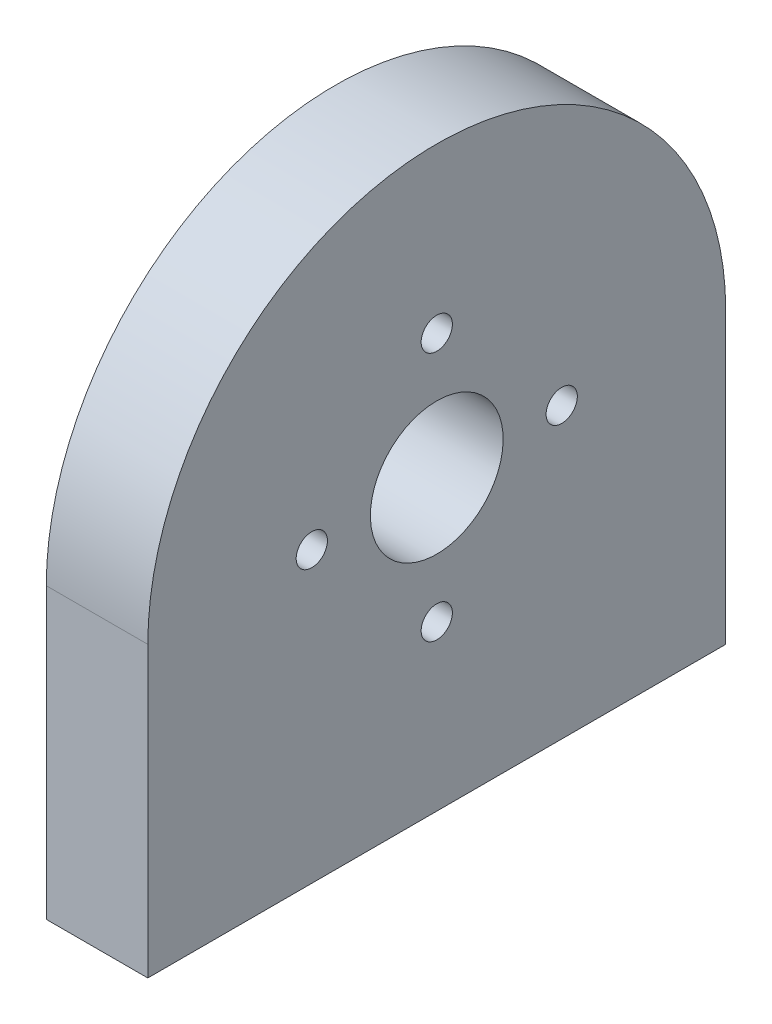
ISO-10303-21;
HEADER;
FILE_DESCRIPTION(('STEP AP214'),'2;1');
FILE_NAME('part.step','',(''),(''),'','','');
FILE_SCHEMA(('AUTOMOTIVE_DESIGN { 1 0 10303 214 1 1 1 1 }'));
ENDSEC;
DATA;
#1=APPLICATION_CONTEXT('core data for automotive mechanical design processes');
#2=APPLICATION_PROTOCOL_DEFINITION('international standard','automotive_design',2000,#1);
#3=PRODUCT_CONTEXT('',#1,'mechanical');
#4=PRODUCT('Part','Part','',(#3));
#5=PRODUCT_RELATED_PRODUCT_CATEGORY('part','',(#4));
#6=PRODUCT_DEFINITION_FORMATION('','',#4);
#7=PRODUCT_DEFINITION_CONTEXT('part definition',#1,'design');
#8=PRODUCT_DEFINITION('design','',#6,#7);
#9=PRODUCT_DEFINITION_SHAPE('','',#8);
#10=(LENGTH_UNIT() NAMED_UNIT(*) SI_UNIT(.MILLI.,.METRE.));
#11=(NAMED_UNIT(*) PLANE_ANGLE_UNIT() SI_UNIT($,.RADIAN.));
#12=(NAMED_UNIT(*) SI_UNIT($,.STERADIAN.) SOLID_ANGLE_UNIT());
#13=UNCERTAINTY_MEASURE_WITH_UNIT(LENGTH_MEASURE(1.E-05),#10,'distance_accuracy_value','');
#14=(GEOMETRIC_REPRESENTATION_CONTEXT(3) GLOBAL_UNCERTAINTY_ASSIGNED_CONTEXT((#13)) GLOBAL_UNIT_ASSIGNED_CONTEXT((#10,
#11,#12)) REPRESENTATION_CONTEXT('',''));
#15=CARTESIAN_POINT('',(0.,0.,0.));
#16=DIRECTION('',(0.,0.,1.));
#17=DIRECTION('',(1.,0.,0.));
#18=AXIS2_PLACEMENT_3D('',#15,#16,#17);
#19=CARTESIAN_POINT('',(-30.,-17.,-27.5));
#20=DIRECTION('',(1.,0.,0.));
#21=DIRECTION('',(0.,1.,0.));
#22=AXIS2_PLACEMENT_3D('',#19,#20,#21);
#23=CYLINDRICAL_SURFACE('',#22,1.);
#24=CARTESIAN_POINT('',(-21.,-17.,-27.5));
#25=DIRECTION('',(1.,0.,0.));
#26=DIRECTION('',(0.,0.,-1.));
#27=AXIS2_PLACEMENT_3D('',#24,#25,#26);
#28=CIRCLE('',#27,1.);
#29=CARTESIAN_POINT('',(-21.,-17.,-28.5));
#30=VERTEX_POINT('',#29);
#31=EDGE_CURVE('E115',#30,#30,#28,.F.);
#32=ORIENTED_EDGE('',*,*,#31,.T.);
#33=EDGE_LOOP('',(#32));
#34=FACE_BOUND('',#33,.T.);
#35=CARTESIAN_POINT('',(-14.5,-17.,-27.5));
#36=DIRECTION('',(1.,0.,0.));
#37=DIRECTION('',(0.,1.,0.));
#38=AXIS2_PLACEMENT_3D('',#35,#36,#37);
#39=CIRCLE('',#38,1.);
#40=CARTESIAN_POINT('',(-14.5,-16.,-27.5));
#41=VERTEX_POINT('',#40);
#42=EDGE_CURVE('E163',#41,#41,#39,.F.);
#43=ORIENTED_EDGE('',*,*,#42,.F.);
#44=EDGE_LOOP('',(#43));
#45=FACE_BOUND('',#44,.T.);
#46=ADVANCED_FACE('F47',(#34,#45),#23,.F.);
#47=CARTESIAN_POINT('',(-30.,-33.,-27.5000000000002));
#48=DIRECTION('',(1.,0.,0.));
#49=DIRECTION('',(0.,1.,0.));
#50=AXIS2_PLACEMENT_3D('',#47,#48,#49);
#51=CYLINDRICAL_SURFACE('',#50,1.);
#52=CARTESIAN_POINT('',(-21.,-33.,-27.5000000000002));
#53=DIRECTION('',(1.,0.,0.));
#54=DIRECTION('',(0.,0.,-1.));
#55=AXIS2_PLACEMENT_3D('',#52,#53,#54);
#56=CIRCLE('',#55,1.);
#57=CARTESIAN_POINT('',(-21.,-33.,-28.5000000000002));
#58=VERTEX_POINT('',#57);
#59=EDGE_CURVE('E127',#58,#58,#56,.F.);
#60=ORIENTED_EDGE('',*,*,#59,.T.);
#61=EDGE_LOOP('',(#60));
#62=FACE_BOUND('',#61,.T.);
#63=CARTESIAN_POINT('',(-14.5,-33.,-27.5000000000002));
#64=DIRECTION('',(1.,0.,0.));
#65=DIRECTION('',(0.,1.,0.));
#66=AXIS2_PLACEMENT_3D('',#63,#64,#65);
#67=CIRCLE('',#66,1.);
#68=CARTESIAN_POINT('',(-14.5,-32.,-27.5000000000002));
#69=VERTEX_POINT('',#68);
#70=EDGE_CURVE('E159',#69,#69,#67,.F.);
#71=ORIENTED_EDGE('',*,*,#70,.F.);
#72=EDGE_LOOP('',(#71));
#73=FACE_BOUND('',#72,.T.);
#74=ADVANCED_FACE('F49',(#62,#73),#51,.F.);
#75=CARTESIAN_POINT('',(-30.,-25.,-19.5000000000001));
#76=DIRECTION('',(1.,0.,0.));
#77=DIRECTION('',(0.,1.,0.));
#78=AXIS2_PLACEMENT_3D('',#75,#76,#77);
#79=CYLINDRICAL_SURFACE('',#78,1.);
#80=CARTESIAN_POINT('',(-21.,-25.,-19.5000000000001));
#81=DIRECTION('',(1.,0.,0.));
#82=DIRECTION('',(0.,0.,-1.));
#83=AXIS2_PLACEMENT_3D('',#80,#81,#82);
#84=CIRCLE('',#83,1.);
#85=CARTESIAN_POINT('',(-21.,-25.,-20.5000000000001));
#86=VERTEX_POINT('',#85);
#87=EDGE_CURVE('E131',#86,#86,#84,.F.);
#88=ORIENTED_EDGE('',*,*,#87,.T.);
#89=EDGE_LOOP('',(#88));
#90=FACE_BOUND('',#89,.T.);
#91=CARTESIAN_POINT('',(-14.5,-25.,-19.5000000000001));
#92=DIRECTION('',(1.,0.,0.));
#93=DIRECTION('',(0.,1.,0.));
#94=AXIS2_PLACEMENT_3D('',#91,#92,#93);
#95=CIRCLE('',#94,1.);
#96=CARTESIAN_POINT('',(-14.5,-24.,-19.5000000000001));
#97=VERTEX_POINT('',#96);
#98=EDGE_CURVE('E155',#97,#97,#95,.F.);
#99=ORIENTED_EDGE('',*,*,#98,.F.);
#100=EDGE_LOOP('',(#99));
#101=FACE_BOUND('',#100,.T.);
#102=ADVANCED_FACE('F179',(#90,#101),#79,.F.);
#103=CARTESIAN_POINT('',(-30.,-25.,-27.5));
#104=DIRECTION('',(1.,0.,0.));
#105=DIRECTION('',(0.,1.,0.));
#106=AXIS2_PLACEMENT_3D('',#103,#104,#105);
#107=CYLINDRICAL_SURFACE('',#106,4.25);
#108=CARTESIAN_POINT('',(-21.,-25.,-27.5));
#109=DIRECTION('',(1.,0.,0.));
#110=DIRECTION('',(0.,0.,-1.));
#111=AXIS2_PLACEMENT_3D('',#108,#109,#110);
#112=CIRCLE('',#111,4.25);
#113=CARTESIAN_POINT('',(-21.,-25.,-31.75));
#114=VERTEX_POINT('',#113);
#115=EDGE_CURVE('E109',#114,#114,#112,.F.);
#116=ORIENTED_EDGE('',*,*,#115,.T.);
#117=EDGE_LOOP('',(#116));
#118=FACE_BOUND('',#117,.T.);
#119=CARTESIAN_POINT('',(-14.5,-25.,-27.5));
#120=DIRECTION('',(1.,0.,0.));
#121=DIRECTION('',(0.,1.,0.));
#122=AXIS2_PLACEMENT_3D('',#119,#120,#121);
#123=CIRCLE('',#122,4.25);
#124=CARTESIAN_POINT('',(-14.5,-20.75,-27.5));
#125=VERTEX_POINT('',#124);
#126=EDGE_CURVE('E151',#125,#125,#123,.F.);
#127=ORIENTED_EDGE('',*,*,#126,.F.);
#128=EDGE_LOOP('',(#127));
#129=FACE_BOUND('',#128,.T.);
#130=ADVANCED_FACE('F187',(#118,#129),#107,.F.);
#131=CARTESIAN_POINT('',(-30.,-24.9999999999999,-35.5000000000001));
#132=DIRECTION('',(1.,0.,0.));
#133=DIRECTION('',(0.,1.,0.));
#134=AXIS2_PLACEMENT_3D('',#131,#132,#133);
#135=CYLINDRICAL_SURFACE('',#134,1.);
#136=CARTESIAN_POINT('',(-21.,-24.9999999999999,-35.5000000000001));
#137=DIRECTION('',(1.,0.,0.));
#138=DIRECTION('',(0.,0.,-1.));
#139=AXIS2_PLACEMENT_3D('',#136,#137,#138);
#140=CIRCLE('',#139,1.);
#141=CARTESIAN_POINT('',(-21.,-24.9999999999999,-36.5000000000001));
#142=VERTEX_POINT('',#141);
#143=EDGE_CURVE('E123',#142,#142,#140,.F.);
#144=ORIENTED_EDGE('',*,*,#143,.T.);
#145=EDGE_LOOP('',(#144));
#146=FACE_BOUND('',#145,.T.);
#147=CARTESIAN_POINT('',(-14.5,-24.9999999999999,-35.5000000000001));
#148=DIRECTION('',(1.,0.,0.));
#149=DIRECTION('',(0.,1.,0.));
#150=AXIS2_PLACEMENT_3D('',#147,#148,#149);
#151=CIRCLE('',#150,1.);
#152=CARTESIAN_POINT('',(-14.5,-23.9999999999999,-35.5000000000001));
#153=VERTEX_POINT('',#152);
#154=EDGE_CURVE('E147',#153,#153,#151,.F.);
#155=ORIENTED_EDGE('',*,*,#154,.F.);
#156=EDGE_LOOP('',(#155));
#157=FACE_BOUND('',#156,.T.);
#158=ADVANCED_FACE('F185',(#146,#157),#135,.F.);
#159=CARTESIAN_POINT('',(-25.,-25.,-27.5));
#160=DIRECTION('',(1.,0.,0.));
#161=DIRECTION('',(0.,1.,0.));
#162=AXIS2_PLACEMENT_3D('',#159,#160,#161);
#163=CYLINDRICAL_SURFACE('',#162,18.5);
#164=DIRECTION('',(1.,0.,0.));
#165=VECTOR('',#164,1.);
#166=CARTESIAN_POINT('',(-25.,-25.,-46.));
#167=LINE('',#166,#165);
#168=CARTESIAN_POINT('',(-21.,-25.,-46.));
#169=VERTEX_POINT('',#168);
#170=CARTESIAN_POINT('',(-14.5,-25.,-46.));
#171=VERTEX_POINT('',#170);
#172=EDGE_CURVE('E51',#169,#171,#167,.T.);
#173=ORIENTED_EDGE('',*,*,#172,.F.);
#174=CARTESIAN_POINT('',(-21.,-25.,-27.5));
#175=DIRECTION('',(1.,0.,0.));
#176=DIRECTION('',(0.,0.,-1.));
#177=AXIS2_PLACEMENT_3D('',#174,#175,#176);
#178=CIRCLE('',#177,18.5);
#179=CARTESIAN_POINT('',(-21.,-25.,-9.00000000000001));
#180=VERTEX_POINT('',#179);
#181=EDGE_CURVE('E110',#180,#169,#178,.F.);
#182=ORIENTED_EDGE('',*,*,#181,.F.);
#183=DIRECTION('',(1.,0.,0.));
#184=VECTOR('',#183,1.);
#185=CARTESIAN_POINT('',(-25.,-25.,-9.00000000000001));
#186=LINE('',#185,#184);
#187=CARTESIAN_POINT('',(-14.5,-25.,-9.00000000000001));
#188=VERTEX_POINT('',#187);
#189=EDGE_CURVE('E11',#180,#188,#186,.T.);
#190=ORIENTED_EDGE('',*,*,#189,.T.);
#191=CARTESIAN_POINT('',(-14.5,-25.,-27.5));
#192=DIRECTION('',(1.,0.,0.));
#193=DIRECTION('',(0.,1.,0.));
#194=AXIS2_PLACEMENT_3D('',#191,#192,#193);
#195=CIRCLE('',#194,18.5);
#196=EDGE_CURVE('E135',#171,#188,#195,.T.);
#197=ORIENTED_EDGE('',*,*,#196,.F.);
#198=EDGE_LOOP('',(#173,#182,#190,#197));
#199=FACE_BOUND('',#198,.T.);
#200=ADVANCED_FACE('F183',(#199),#163,.T.);
#201=CARTESIAN_POINT('',(-21.,-159.75,-55.));
#202=DIRECTION('',(1.,0.,0.));
#203=DIRECTION('',(0.,0.,-1.));
#204=AXIS2_PLACEMENT_3D('',#201,#202,#203);
#205=PLANE('',#204);
#206=ORIENTED_EDGE('',*,*,#87,.F.);
#207=EDGE_LOOP('',(#206));
#208=FACE_BOUND('',#207,.T.);
#209=ORIENTED_EDGE('',*,*,#143,.F.);
#210=EDGE_LOOP('',(#209));
#211=FACE_BOUND('',#210,.T.);
#212=ORIENTED_EDGE('',*,*,#115,.F.);
#213=EDGE_LOOP('',(#212));
#214=FACE_BOUND('',#213,.T.);
#215=ORIENTED_EDGE('',*,*,#31,.F.);
#216=EDGE_LOOP('',(#215));
#217=FACE_BOUND('',#216,.T.);
#218=ORIENTED_EDGE('',*,*,#59,.F.);
#219=EDGE_LOOP('',(#218));
#220=FACE_BOUND('',#219,.T.);
#221=DIRECTION('',(0.,1.,0.));
#222=VECTOR('',#221,1.);
#223=CARTESIAN_POINT('',(-21.,0.,-46.));
#224=LINE('',#223,#222);
#225=CARTESIAN_POINT('',(-21.,-43.5,-46.));
#226=VERTEX_POINT('',#225);
#227=EDGE_CURVE('E103',#226,#169,#224,.T.);
#228=ORIENTED_EDGE('',*,*,#227,.F.);
#229=DIRECTION('',(0.,0.,-1.));
#230=VECTOR('',#229,1.);
#231=CARTESIAN_POINT('',(-21.,-43.5,-46.));
#232=LINE('',#231,#230);
#233=CARTESIAN_POINT('',(-21.,-43.5,-9.00000000000001));
#234=VERTEX_POINT('',#233);
#235=EDGE_CURVE('E89',#234,#226,#232,.T.);
#236=ORIENTED_EDGE('',*,*,#235,.F.);
#237=DIRECTION('',(0.,1.,0.));
#238=VECTOR('',#237,1.);
#239=CARTESIAN_POINT('',(-21.,0.,-9.00000000000001));
#240=LINE('',#239,#238);
#241=EDGE_CURVE('E101',#234,#180,#240,.T.);
#242=ORIENTED_EDGE('',*,*,#241,.T.);
#243=ORIENTED_EDGE('',*,*,#181,.T.);
#244=EDGE_LOOP('',(#228,#236,#242,#243));
#245=FACE_BOUND('',#244,.T.);
#246=ADVANCED_FACE('F99',(#208,#211,#214,#217,#220,#245),#205,.F.);
#247=CARTESIAN_POINT('',(-14.5,0.,0.));
#248=DIRECTION('',(1.,0.,0.));
#249=DIRECTION('',(0.,1.,0.));
#250=AXIS2_PLACEMENT_3D('',#247,#248,#249);
#251=PLANE('',#250);
#252=ORIENTED_EDGE('',*,*,#196,.T.);
#253=DIRECTION('',(0.,-1.,0.));
#254=VECTOR('',#253,1.);
#255=CARTESIAN_POINT('',(-14.5,0.,-9.00000000000001));
#256=LINE('',#255,#254);
#257=CARTESIAN_POINT('',(-14.5,-43.5,-9.00000000000001));
#258=VERTEX_POINT('',#257);
#259=EDGE_CURVE('E139',#188,#258,#256,.T.);
#260=ORIENTED_EDGE('',*,*,#259,.T.);
#261=DIRECTION('',(0.,0.,-1.));
#262=VECTOR('',#261,1.);
#263=CARTESIAN_POINT('',(-14.5,-43.5,0.));
#264=LINE('',#263,#262);
#265=CARTESIAN_POINT('',(-14.5,-43.5,-46.));
#266=VERTEX_POINT('',#265);
#267=EDGE_CURVE('E90',#258,#266,#264,.T.);
#268=ORIENTED_EDGE('',*,*,#267,.T.);
#269=DIRECTION('',(0.,1.,0.));
#270=VECTOR('',#269,1.);
#271=CARTESIAN_POINT('',(-14.5,0.,-46.));
#272=LINE('',#271,#270);
#273=EDGE_CURVE('E144',#266,#171,#272,.T.);
#274=ORIENTED_EDGE('',*,*,#273,.T.);
#275=EDGE_LOOP('',(#252,#260,#268,#274));
#276=FACE_BOUND('',#275,.T.);
#277=ORIENTED_EDGE('',*,*,#154,.T.);
#278=EDGE_LOOP('',(#277));
#279=FACE_BOUND('',#278,.T.);
#280=ORIENTED_EDGE('',*,*,#126,.T.);
#281=EDGE_LOOP('',(#280));
#282=FACE_BOUND('',#281,.T.);
#283=ORIENTED_EDGE('',*,*,#98,.T.);
#284=EDGE_LOOP('',(#283));
#285=FACE_BOUND('',#284,.T.);
#286=ORIENTED_EDGE('',*,*,#70,.T.);
#287=EDGE_LOOP('',(#286));
#288=FACE_BOUND('',#287,.T.);
#289=ORIENTED_EDGE('',*,*,#42,.T.);
#290=EDGE_LOOP('',(#289));
#291=FACE_BOUND('',#290,.T.);
#292=ADVANCED_FACE('F169',(#276,#279,#282,#285,#288,#291),#251,.T.);
#293=CARTESIAN_POINT('',(-25.,0.,-46.));
#294=DIRECTION('',(0.,0.,1.));
#295=DIRECTION('',(1.,0.,0.));
#296=AXIS2_PLACEMENT_3D('',#293,#294,#295);
#297=PLANE('',#296);
#298=ORIENTED_EDGE('',*,*,#273,.F.);
#299=DIRECTION('',(-1.,0.,0.));
#300=VECTOR('',#299,1.);
#301=CARTESIAN_POINT('',(21.,-43.5,-46.));
#302=LINE('',#301,#300);
#303=EDGE_CURVE('E70',#266,#226,#302,.T.);
#304=ORIENTED_EDGE('',*,*,#303,.T.);
#305=ORIENTED_EDGE('',*,*,#227,.T.);
#306=ORIENTED_EDGE('',*,*,#172,.T.);
#307=EDGE_LOOP('',(#298,#304,#305,#306));
#308=FACE_BOUND('',#307,.T.);
#309=ADVANCED_FACE('F200',(#308),#297,.F.);
#310=CARTESIAN_POINT('',(-25.,0.,-9.00000000000001));
#311=DIRECTION('',(0.,0.,1.));
#312=DIRECTION('',(1.,0.,0.));
#313=AXIS2_PLACEMENT_3D('',#310,#311,#312);
#314=PLANE('',#313);
#315=DIRECTION('',(-1.,0.,0.));
#316=VECTOR('',#315,1.);
#317=CARTESIAN_POINT('',(21.,-43.5,-9.00000000000001));
#318=LINE('',#317,#316);
#319=EDGE_CURVE('E86',#258,#234,#318,.T.);
#320=ORIENTED_EDGE('',*,*,#319,.F.);
#321=ORIENTED_EDGE('',*,*,#259,.F.);
#322=ORIENTED_EDGE('',*,*,#189,.F.);
#323=ORIENTED_EDGE('',*,*,#241,.F.);
#324=EDGE_LOOP('',(#320,#321,#322,#323));
#325=FACE_BOUND('',#324,.T.);
#326=ADVANCED_FACE('F107',(#325),#314,.T.);
#327=CARTESIAN_POINT('',(21.,-43.5,-46.));
#328=DIRECTION('',(0.,1.,0.));
#329=DIRECTION('',(0.,0.,1.));
#330=AXIS2_PLACEMENT_3D('',#327,#328,#329);
#331=PLANE('',#330);
#332=ORIENTED_EDGE('',*,*,#319,.T.);
#333=ORIENTED_EDGE('',*,*,#235,.T.);
#334=ORIENTED_EDGE('',*,*,#303,.F.);
#335=ORIENTED_EDGE('',*,*,#267,.F.);
#336=EDGE_LOOP('',(#332,#333,#334,#335));
#337=FACE_BOUND('',#336,.T.);
#338=ADVANCED_FACE('F88',(#337),#331,.F.);
#339=CLOSED_SHELL('',(#46,#74,#102,#130,#158,#200,#246,#292,#309,#326,#338));
#340=MANIFOLD_SOLID_BREP('B2',#339);
#341=ADVANCED_BREP_SHAPE_REPRESENTATION('',(#18,#340),#14);
#342=SHAPE_DEFINITION_REPRESENTATION(#9,#341);
ENDSEC;
END-ISO-10303-21;
